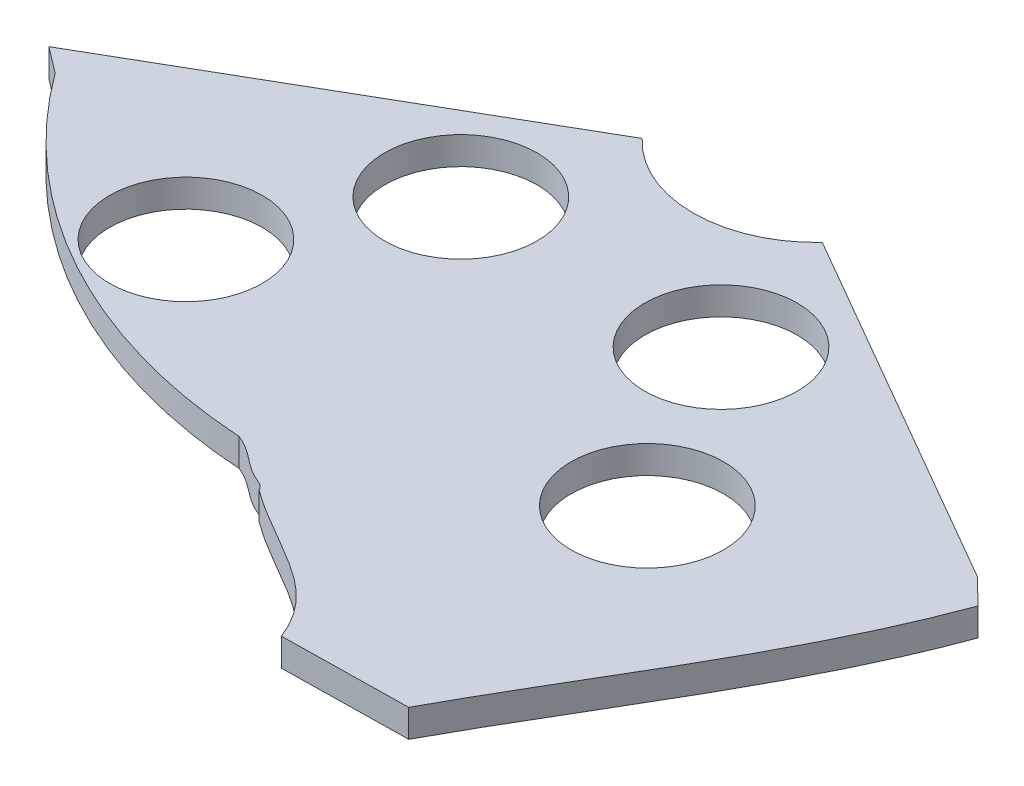
ISO-10303-21;
HEADER;
FILE_DESCRIPTION(('STEP AP214'),'2;1');
FILE_NAME('part.step','',(''),(''),'','','');
FILE_SCHEMA(('AUTOMOTIVE_DESIGN { 1 0 10303 214 1 1 1 1 }'));
ENDSEC;
DATA;
#1=APPLICATION_CONTEXT('core data for automotive mechanical design processes');
#2=APPLICATION_PROTOCOL_DEFINITION('international standard','automotive_design',2000,#1);
#3=PRODUCT_CONTEXT('',#1,'mechanical');
#4=PRODUCT('Part','Part','',(#3));
#5=PRODUCT_RELATED_PRODUCT_CATEGORY('part','',(#4));
#6=PRODUCT_DEFINITION_FORMATION('','',#4);
#7=PRODUCT_DEFINITION_CONTEXT('part definition',#1,'design');
#8=PRODUCT_DEFINITION('design','',#6,#7);
#9=PRODUCT_DEFINITION_SHAPE('','',#8);
#10=(LENGTH_UNIT() NAMED_UNIT(*) SI_UNIT(.MILLI.,.METRE.));
#11=(NAMED_UNIT(*) PLANE_ANGLE_UNIT() SI_UNIT($,.RADIAN.));
#12=(NAMED_UNIT(*) SI_UNIT($,.STERADIAN.) SOLID_ANGLE_UNIT());
#13=UNCERTAINTY_MEASURE_WITH_UNIT(LENGTH_MEASURE(1.E-05),#10,'distance_accuracy_value','');
#14=(GEOMETRIC_REPRESENTATION_CONTEXT(3) GLOBAL_UNCERTAINTY_ASSIGNED_CONTEXT((#13)) GLOBAL_UNIT_ASSIGNED_CONTEXT((#10,
#11,#12)) REPRESENTATION_CONTEXT('',''));
#15=CARTESIAN_POINT('',(0.,0.,0.));
#16=DIRECTION('',(0.,0.,1.));
#17=DIRECTION('',(1.,0.,0.));
#18=AXIS2_PLACEMENT_3D('',#15,#16,#17);
#19=CARTESIAN_POINT('',(0.,-59.7359999999999,0.));
#20=DIRECTION('',(0.,-1.,0.));
#21=DIRECTION('',(0.,0.,-1.));
#22=AXIS2_PLACEMENT_3D('',#19,#20,#21);
#23=PLANE('',#22);
#24=CARTESIAN_POINT('',(18.75,-59.7359999999999,32.476));
#25=DIRECTION('',(0.,-1.,0.));
#26=DIRECTION('',(0.,0.,-1.));
#27=AXIS2_PLACEMENT_3D('',#24,#25,#26);
#28=CIRCLE('',#27,10.999845998306);
#29=CARTESIAN_POINT('',(18.75,-59.7359999999999,21.476154001694));
#30=VERTEX_POINT('',#29);
#31=EDGE_CURVE('E330',#30,#30,#28,.T.);
#32=ORIENTED_EDGE('',*,*,#31,.F.);
#33=EDGE_LOOP('',(#32));
#34=FACE_BOUND('',#33,.T.);
#35=CARTESIAN_POINT('',(-33.25,-59.7359999999999,57.591));
#36=DIRECTION('',(0.,-1.,0.));
#37=DIRECTION('',(0.,0.,-1.));
#38=AXIS2_PLACEMENT_3D('',#35,#36,#37);
#39=CIRCLE('',#38,10.999845998306);
#40=CARTESIAN_POINT('',(-33.25,-59.7359999999999,46.591154001694));
#41=VERTEX_POINT('',#40);
#42=EDGE_CURVE('E323',#41,#41,#39,.T.);
#43=ORIENTED_EDGE('',*,*,#42,.F.);
#44=EDGE_LOOP('',(#43));
#45=FACE_BOUND('',#44,.T.);
#46=DIRECTION('',(-0.795778748412786,0.,-0.605587469796543));
#47=VECTOR('',#46,1.);
#48=CARTESIAN_POINT('',(-63.3976054615555,-59.7359999999999,46.2919343296422));
#49=LINE('',#48,#47);
#50=CARTESIAN_POINT('',(-63.3976054615555,-59.7359999999999,46.2919343296422));
#51=VERTEX_POINT('',#50);
#52=CARTESIAN_POINT('',(-67.1861912285639,-59.7359999999999,43.4088213119524));
#53=VERTEX_POINT('',#52);
#54=EDGE_CURVE('E319',#51,#53,#49,.T.);
#55=ORIENTED_EDGE('',*,*,#54,.T.);
#56=DIRECTION('',(0.866025113443952,0.,-0.500000502884138));
#57=VECTOR('',#56,1.);
#58=CARTESIAN_POINT('',(-67.1861912285639,-59.7359999999999,43.4088213119524));
#59=LINE('',#58,#57);
#60=CARTESIAN_POINT('',(-12.9766531358799,-59.7359999999999,12.1108879302399));
#61=VERTEX_POINT('',#60);
#62=EDGE_CURVE('E101',#53,#61,#59,.T.);
#63=ORIENTED_EDGE('',*,*,#62,.T.);
#64=CARTESIAN_POINT('',(0.,-59.7359999999999,0.));
#65=DIRECTION('',(0.,1.,0.));
#66=DIRECTION('',(0.,0.,-1.));
#67=AXIS2_PLACEMENT_3D('',#64,#65,#66);
#68=CIRCLE('',#67,17.7501305084715);
#69=CARTESIAN_POINT('',(12.9766531358511,-59.7359999999999,12.1108879302707));
#70=VERTEX_POINT('',#69);
#71=EDGE_CURVE('E316',#61,#70,#68,.T.);
#72=ORIENTED_EDGE('',*,*,#71,.T.);
#73=DIRECTION('',(0.866025113442762,0.,0.500000502886198));
#74=VECTOR('',#73,1.);
#75=CARTESIAN_POINT('',(12.9766531358511,-59.7359999999999,12.1108879302707));
#76=LINE('',#75,#74);
#77=CARTESIAN_POINT('',(65.8946490574716,-59.7359999999999,42.6631480920527));
#78=VERTEX_POINT('',#77);
#79=EDGE_CURVE('E311',#70,#78,#76,.T.);
#80=ORIENTED_EDGE('',*,*,#79,.T.);
#81=DIRECTION('',(0.714858802905581,0.,0.699268826638511));
#82=VECTOR('',#81,1.);
#83=CARTESIAN_POINT('',(65.8946490574716,-59.7359999999999,42.6631480920527));
#84=LINE('',#83,#82);
#85=CARTESIAN_POINT('',(69.5740968074287,-59.7359999999999,46.262352718662));
#86=VERTEX_POINT('',#85);
#87=EDGE_CURVE('E292',#78,#86,#84,.T.);
#88=ORIENTED_EDGE('',*,*,#87,.T.);
#89=CARTESIAN_POINT('',(41.2022316805523,-59.7359999999999,99.9375894083744));
#90=CARTESIAN_POINT('',(41.587590850784,-59.7359999999999,99.2311174933776));
#91=CARTESIAN_POINT('',(42.4034808120674,-59.7359999999999,97.7353613575421));
#92=CARTESIAN_POINT('',(43.7326495851466,-59.7359999999999,95.3570769045197));
#93=CARTESIAN_POINT('',(45.1853632791796,-59.7359999999999,92.800608914617));
#94=CARTESIAN_POINT('',(47.2275819494652,-59.7359999999999,89.2653916030542));
#95=CARTESIAN_POINT('',(49.814915188434,-59.7359999999999,84.8664305212319));
#96=CARTESIAN_POINT('',(52.930931883902,-59.7359999999999,79.5943849454348));
#97=CARTESIAN_POINT('',(56.0131271613358,-59.7359999999999,74.3030822466267));
#98=CARTESIAN_POINT('',(59.0165757328589,-59.7359999999999,68.9704357376071));
#99=CARTESIAN_POINT('',(61.8976180321011,-59.7359999999999,63.577037593729));
#100=CARTESIAN_POINT('',(64.3234409959134,-59.7359999999999,58.692273061032));
#101=CARTESIAN_POINT('',(66.314934083995,-59.7359999999999,54.3541361936122));
#102=CARTESIAN_POINT('',(67.9112616717491,-59.7359999999999,50.6071095903698));
#103=CARTESIAN_POINT('',(68.9692965092425,-59.7359999999999,47.905511475029));
#104=CARTESIAN_POINT('',(69.5022446270759,-59.7359999999999,46.4575651543451));
#105=CARTESIAN_POINT('',(69.5740968074287,-59.7359999999999,46.262352718662));
#106=B_SPLINE_CURVE_WITH_KNOTS('',3,(#89,#90,#91,#92,#93,#94,#95,#96,#97,#98,#99,#100,#101,#102,
#103,#104,#105),.UNSPECIFIED.,.F.,.F.,(4,1,1,1,1,1,1,1,1,1,1,1,1,1,4),(0.,0.0397133337730413,
0.084081845866122,0.134451050187205,0.184819560422879,0.285559850952788,0.386302098336289,
0.487039816466733,0.587749506713704,0.688318548702813,0.78876366613469,0.856846763089356,
0.923857801930417,0.989734492411012,1.),.UNSPECIFIED.);
#107=CARTESIAN_POINT('',(41.2022316805523,-59.7359999999999,99.9375894083744));
#108=VERTEX_POINT('',#107);
#109=EDGE_CURVE('E244',#86,#108,#106,.F.);
#110=ORIENTED_EDGE('',*,*,#109,.T.);
#111=DIRECTION('',(-0.999865416606513,0.,0.0164057512563092));
#112=VECTOR('',#111,1.);
#113=CARTESIAN_POINT('',(41.2022316805523,-59.7359999999999,99.9375894083744));
#114=LINE('',#113,#112);
#115=CARTESIAN_POINT('',(23.1548354485309,-59.7359999999999,100.233710354743));
#116=VERTEX_POINT('',#115);
#117=EDGE_CURVE('E128',#108,#116,#114,.T.);
#118=ORIENTED_EDGE('',*,*,#117,.T.);
#119=CARTESIAN_POINT('',(3.30286328056951,-59.7359999999999,83.5958777362196));
#120=CARTESIAN_POINT('',(3.3608909746237,-59.7359999999999,83.6389832121567));
#121=CARTESIAN_POINT('',(3.70442717781917,-59.7359999999999,83.8926363081411));
#122=CARTESIAN_POINT('',(4.38582003086082,-59.7359999999999,84.3796681121888));
#123=CARTESIAN_POINT('',(5.33763976577211,-59.7359999999999,85.0223883529612));
#124=CARTESIAN_POINT('',(6.32831377654757,-59.7359999999999,85.6585236441902));
#125=CARTESIAN_POINT('',(7.63510659117863,-59.7359999999999,86.4643297552144));
#126=CARTESIAN_POINT('',(9.2912723206019,-59.7359999999999,87.4377400955666));
#127=CARTESIAN_POINT('',(11.2916173590414,-59.7359999999999,88.584841295683));
#128=CARTESIAN_POINT('',(13.2826935567036,-59.7359999999999,89.7481182065134));
#129=CARTESIAN_POINT('',(15.2427814807173,-59.7359999999999,90.9655428347965));
#130=CARTESIAN_POINT('',(17.1337855048151,-59.7359999999999,92.2885452830852));
#131=CARTESIAN_POINT('',(18.6090414025556,-59.7359999999999,93.5279288708465));
#132=CARTESIAN_POINT('',(19.6875252153407,-59.7359999999999,94.614708458911));
#133=CARTESIAN_POINT('',(20.4404680205473,-59.7359999999999,95.4791931501594));
#134=CARTESIAN_POINT('',(21.1319454879863,-59.7359999999999,96.3930602987408));
#135=CARTESIAN_POINT('',(21.6329382160324,-59.7359999999999,97.1609273376954));
#136=CARTESIAN_POINT('',(21.9780920152773,-59.7359999999999,97.7490006718454));
#137=CARTESIAN_POINT('',(22.1947605858977,-59.7359999999999,98.1409934068086));
#138=CARTESIAN_POINT('',(22.4032360485551,-59.7359999999999,98.5418147536676));
#139=CARTESIAN_POINT('',(22.6036728898914,-59.7359999999999,98.9515298694288));
#140=CARTESIAN_POINT('',(22.795929091683,-59.7359999999999,99.3702957052518));
#141=CARTESIAN_POINT('',(22.9809507296413,-59.7359999999999,99.7978314683164));
#142=CARTESIAN_POINT('',(23.0966528751182,-59.7359999999999,100.087863408154));
#143=CARTESIAN_POINT('',(23.1548354485267,-59.7359999999999,100.233710354732));
#144=B_SPLINE_CURVE_WITH_KNOTS('',3,(#119,#120,#121,#122,#123,#124,#125,#126,#127,#128,#129,
#130,#131,#132,#133,#134,#135,#136,#137,#138,#139,#140,#141,#142,#143),.UNSPECIFIED.,.F.,.F.,(4,
1,1,1,1,1,1,1,1,1,1,1,1,1,1,1,1,1,1,1,1,1,4),(3.97459842815806E-13,0.00767665972014964,
0.045349840796591,0.0889469985817752,0.129639070193832,0.170382328198246,0.251994615879282,
0.333651337507287,0.415288377679459,0.496898919047709,0.57864917083408,0.660218146277274,
0.701107392742712,0.741158581153687,0.781882858535246,0.822722833742814,0.838448214590161,
0.854297569189187,0.870285875653164,0.886427244551638,0.902734899223733,0.919221163728598,
0.935897457732388),.UNSPECIFIED.);
#145=CARTESIAN_POINT('',(3.30286328056951,-59.7359999999999,83.5958777362196));
#146=VERTEX_POINT('',#145);
#147=EDGE_CURVE('E120',#116,#146,#144,.F.);
#148=ORIENTED_EDGE('',*,*,#147,.T.);
#149=CARTESIAN_POINT('',(-4.80739946604368,-59.7359999999999,78.3520188363465));
#150=CARTESIAN_POINT('',(-4.73455750919589,-59.7359999999999,78.3812123659429));
#151=CARTESIAN_POINT('',(-4.59647391436689,-59.7359999999999,78.4365533766302));
#152=CARTESIAN_POINT('',(-4.3066154627874,-59.7359999999999,78.561126644264));
#153=CARTESIAN_POINT('',(-3.79140364004989,-59.7359999999999,78.8027291367296));
#154=CARTESIAN_POINT('',(-3.065391075989,-59.7359999999999,79.2091978337572));
#155=CARTESIAN_POINT('',(-2.23987012826526,-59.7359999999999,79.7708204394431));
#156=CARTESIAN_POINT('',(-1.57901410093857,-59.7359999999999,80.2776897801323));
#157=CARTESIAN_POINT('',(-1.05231170950876,-59.7359999999999,80.6876743089049));
#158=CARTESIAN_POINT('',(-0.522756427642757,-59.7359999999999,81.0928916417694));
#159=CARTESIAN_POINT('',(0.154236222637435,-59.7359999999999,81.5779314075019));
#160=CARTESIAN_POINT('',(0.869839658943289,-59.7359999999999,82.0059207982046));
#161=CARTESIAN_POINT('',(1.38063736938718,-59.7359999999999,82.2600452104259));
#162=CARTESIAN_POINT('',(2.20063168074346,-59.7359999999999,82.6307927810848));
#163=CARTESIAN_POINT('',(2.90888002950248,-59.7359999999999,82.839217800842));
#164=CARTESIAN_POINT('',(3.30286328056951,-59.7359999999999,83.5958777362196));
#165=B_SPLINE_CURVE_WITH_KNOTS('',3,(#149,#150,#151,#152,#153,#154,#155,#156,#157,#158,#159,
#160,#161,#162,#163,#164),.UNSPECIFIED.,.F.,.F.,(4,1,1,1,1,1,1,1,1,1,1,1,1,4),
(-0.384221548559676,-0.354367447155518,-0.327628318220057,-0.264203388830081,-0.137946895486287,
-0.0115855922126117,0.115315082359378,0.178857348466051,0.242349904739312,0.369001069391675,
0.495501743094686,0.559041797539317,0.585959556689903,0.837832479723285),.UNSPECIFIED.);
#166=CARTESIAN_POINT('',(-4.80739946604369,-59.7359999999999,78.3520188363465));
#167=VERTEX_POINT('',#166);
#168=EDGE_CURVE('E125',#146,#167,#165,.F.);
#169=ORIENTED_EDGE('',*,*,#168,.T.);
#170=CARTESIAN_POINT('',(-63.3976054615555,-59.7359999999999,46.2919343296422));
#171=CARTESIAN_POINT('',(-61.7027545982898,-59.7359999999999,48.61405866068));
#172=CARTESIAN_POINT('',(-59.88107195284,-59.7359999999999,50.8409339533637));
#173=CARTESIAN_POINT('',(-56.001446687664,-59.7359999999999,55.0843881225585));
#174=CARTESIAN_POINT('',(-53.9451285067241,-59.7359999999999,57.0999477017867));
#175=CARTESIAN_POINT('',(-47.46495092182,-59.7359999999999,62.7891006094329));
#176=CARTESIAN_POINT('',(-42.7252883495876,-59.7359999999999,66.1049510104305));
#177=CARTESIAN_POINT('',(-32.6399911130492,-59.7359999999999,71.6239606867097));
#178=CARTESIAN_POINT('',(-27.2922142818301,-59.7359999999999,73.8277759318656));
#179=CARTESIAN_POINT('',(-16.2451122340973,-59.7359999999999,77.0150372937901));
#180=CARTESIAN_POINT('',(-10.5460609124712,-59.7359999999999,78.0002270341735));
#181=CARTESIAN_POINT('',(-4.80739946632093,-59.7359999999999,78.3520188408731));
#182=B_SPLINE_CURVE_WITH_KNOTS('',3,(#170,#171,#172,#173,#174,#175,#176,#177,#178,#179,#180,
#181),.UNSPECIFIED.,.F.,.F.,(4,2,2,2,2,4),(1.46671355860661E-06,0.125001466713558,
0.250001466713558,0.500001466713558,0.750001466713558,1.),.UNSPECIFIED.);
#183=EDGE_CURVE('E49',#167,#51,#182,.F.);
#184=ORIENTED_EDGE('',*,*,#183,.T.);
#185=EDGE_LOOP('',(#55,#63,#72,#80,#88,#110,#118,#148,#169,#184));
#186=FACE_BOUND('',#185,.T.);
#187=CARTESIAN_POINT('',(33.25,-59.7359999999999,57.591));
#188=DIRECTION('',(0.,-1.,0.));
#189=DIRECTION('',(0.,0.,-1.));
#190=AXIS2_PLACEMENT_3D('',#187,#188,#189);
#191=CIRCLE('',#190,10.999845998306);
#192=CARTESIAN_POINT('',(33.25,-59.7359999999999,46.591154001694));
#193=VERTEX_POINT('',#192);
#194=EDGE_CURVE('E324',#193,#193,#191,.T.);
#195=ORIENTED_EDGE('',*,*,#194,.F.);
#196=EDGE_LOOP('',(#195));
#197=FACE_BOUND('',#196,.T.);
#198=CARTESIAN_POINT('',(-18.75,-59.7359999999999,32.476));
#199=DIRECTION('',(0.,-1.,0.));
#200=DIRECTION('',(0.,0.,-1.));
#201=AXIS2_PLACEMENT_3D('',#198,#199,#200);
#202=CIRCLE('',#201,10.999845998306);
#203=CARTESIAN_POINT('',(-18.75,-59.7359999999999,21.476154001694));
#204=VERTEX_POINT('',#203);
#205=EDGE_CURVE('E336',#204,#204,#202,.T.);
#206=ORIENTED_EDGE('',*,*,#205,.F.);
#207=EDGE_LOOP('',(#206));
#208=FACE_BOUND('',#207,.T.);
#209=ADVANCED_FACE('F30',(#34,#45,#186,#197,#208),#23,.T.);
#210=CARTESIAN_POINT('',(0.,-55.7359999999999,0.));
#211=DIRECTION('',(0.,-1.,0.));
#212=DIRECTION('',(0.,0.,-1.));
#213=AXIS2_PLACEMENT_3D('',#210,#211,#212);
#214=PLANE('',#213);
#215=CARTESIAN_POINT('',(18.75,-55.7359999999999,32.476));
#216=DIRECTION('',(0.,-1.,0.));
#217=DIRECTION('',(0.,0.,-1.));
#218=AXIS2_PLACEMENT_3D('',#215,#216,#217);
#219=CIRCLE('',#218,10.999845998306);
#220=CARTESIAN_POINT('',(18.75,-55.7359999999999,21.476154001694));
#221=VERTEX_POINT('',#220);
#222=EDGE_CURVE('E333',#221,#221,#219,.T.);
#223=ORIENTED_EDGE('',*,*,#222,.T.);
#224=EDGE_LOOP('',(#223));
#225=FACE_BOUND('',#224,.T.);
#226=CARTESIAN_POINT('',(-33.25,-55.7359999999999,57.591));
#227=DIRECTION('',(0.,-1.,0.));
#228=DIRECTION('',(0.,0.,-1.));
#229=AXIS2_PLACEMENT_3D('',#226,#227,#228);
#230=CIRCLE('',#229,10.999845998306);
#231=CARTESIAN_POINT('',(-33.25,-55.7359999999999,46.591154001694));
#232=VERTEX_POINT('',#231);
#233=EDGE_CURVE('E320',#232,#232,#230,.T.);
#234=ORIENTED_EDGE('',*,*,#233,.T.);
#235=EDGE_LOOP('',(#234));
#236=FACE_BOUND('',#235,.T.);
#237=DIRECTION('',(-0.795778748412786,0.,-0.605587469796543));
#238=VECTOR('',#237,1.);
#239=CARTESIAN_POINT('',(-63.3976054615555,-55.7359999999999,46.2919343296422));
#240=LINE('',#239,#238);
#241=CARTESIAN_POINT('',(-63.3976054615555,-55.7359999999999,46.2919343296422));
#242=VERTEX_POINT('',#241);
#243=CARTESIAN_POINT('',(-67.1861912285639,-55.7359999999999,43.4088213119524));
#244=VERTEX_POINT('',#243);
#245=EDGE_CURVE('E192',#242,#244,#240,.T.);
#246=ORIENTED_EDGE('',*,*,#245,.F.);
#247=CARTESIAN_POINT('',(-4.80729846205365,-55.7359999999999,78.3520250325778));
#248=CARTESIAN_POINT('',(-10.5459940410661,-55.7359999999999,78.0002385941496));
#249=CARTESIAN_POINT('',(-16.2450798281336,-55.7359999999999,77.0150466434164));
#250=CARTESIAN_POINT('',(-27.2922142818301,-55.7359999999999,73.8277759318656));
#251=CARTESIAN_POINT('',(-32.6399911130492,-55.7359999999999,71.6239606867097));
#252=CARTESIAN_POINT('',(-42.7252883495876,-55.7359999999999,66.1049510104305));
#253=CARTESIAN_POINT('',(-47.46495092182,-55.7359999999999,62.7891006094329));
#254=CARTESIAN_POINT('',(-53.9451285067241,-55.7359999999999,57.0999477017867));
#255=CARTESIAN_POINT('',(-56.001446687664,-55.7359999999999,55.0843881225585));
#256=CARTESIAN_POINT('',(-59.88107195284,-55.7359999999999,50.8409339533637));
#257=CARTESIAN_POINT('',(-61.7027545982898,-55.7359999999999,48.61405866068));
#258=CARTESIAN_POINT('',(-63.3976054615555,-55.7359999999999,46.2919343296422));
#259=B_SPLINE_CURVE_WITH_KNOTS('',3,(#247,#248,#249,#250,#251,#252,#253,#254,#255,#256,#257,
#258),.UNSPECIFIED.,.F.,.F.,(4,2,2,2,2,4),(0.,0.25,0.5,0.75,0.875,1.),.UNSPECIFIED.);
#260=CARTESIAN_POINT('',(-4.80739946604369,-55.7359999999999,78.3520188363465));
#261=VERTEX_POINT('',#260);
#262=EDGE_CURVE('E92',#261,#242,#259,.T.);
#263=ORIENTED_EDGE('',*,*,#262,.F.);
#264=CARTESIAN_POINT('',(3.30286328056951,-55.7359999999999,83.5958777362196));
#265=CARTESIAN_POINT('',(2.90888002950248,-55.7359999999999,82.839217800842));
#266=CARTESIAN_POINT('',(2.20063168074346,-55.7359999999999,82.6307927810848));
#267=CARTESIAN_POINT('',(1.38063736938718,-55.7359999999999,82.2600452104259));
#268=CARTESIAN_POINT('',(0.869839658943289,-55.7359999999999,82.0059207982046));
#269=CARTESIAN_POINT('',(0.154236222637435,-55.7359999999999,81.5779314075019));
#270=CARTESIAN_POINT('',(-0.522756427642757,-55.7359999999999,81.0928916417694));
#271=CARTESIAN_POINT('',(-1.05231170950876,-55.7359999999999,80.6876743089049));
#272=CARTESIAN_POINT('',(-1.57901410093857,-55.7359999999999,80.2776897801323));
#273=CARTESIAN_POINT('',(-2.23987012826526,-55.7359999999999,79.7708204394431));
#274=CARTESIAN_POINT('',(-3.065391075989,-55.7359999999999,79.2091978337572));
#275=CARTESIAN_POINT('',(-3.79140364004989,-55.7359999999999,78.8027291367296));
#276=CARTESIAN_POINT('',(-4.3066154627874,-55.7359999999999,78.561126644264));
#277=CARTESIAN_POINT('',(-4.59647391436689,-55.7359999999999,78.4365533766302));
#278=CARTESIAN_POINT('',(-4.73455750919589,-55.7359999999999,78.3812123659429));
#279=CARTESIAN_POINT('',(-4.80739946604368,-55.7359999999999,78.3520188363465));
#280=B_SPLINE_CURVE_WITH_KNOTS('',3,(#264,#265,#266,#267,#268,#269,#270,#271,#272,#273,#274,
#275,#276,#277,#278,#279),.UNSPECIFIED.,.F.,.F.,(4,1,1,1,1,1,1,1,1,1,1,1,1,4),
(-0.384221548559676,-0.132348625526295,-0.105430866375709,-0.0418908119310771,0.084609861771933,
0.211261026424296,0.274753582697558,0.338295848804231,0.46519652337622,0.591557826649895,
0.717814319993689,0.781239249383665,0.807978378319127,0.837832479723285),.UNSPECIFIED.);
#281=CARTESIAN_POINT('',(3.30286328056951,-55.7359999999999,83.5958777362196));
#282=VERTEX_POINT('',#281);
#283=EDGE_CURVE('E85',#282,#261,#280,.T.);
#284=ORIENTED_EDGE('',*,*,#283,.F.);
#285=CARTESIAN_POINT('',(23.1548354485267,-55.7359999999999,100.233710354732));
#286=CARTESIAN_POINT('',(23.0966528751182,-55.7359999999999,100.087863408154));
#287=CARTESIAN_POINT('',(22.9809507296413,-55.7359999999999,99.7978314683164));
#288=CARTESIAN_POINT('',(22.795929091683,-55.7359999999999,99.3702957052518));
#289=CARTESIAN_POINT('',(22.6036728898914,-55.7359999999999,98.9515298694288));
#290=CARTESIAN_POINT('',(22.4032360485551,-55.7359999999999,98.5418147536676));
#291=CARTESIAN_POINT('',(22.1947605858977,-55.7359999999999,98.1409934068086));
#292=CARTESIAN_POINT('',(21.9780920152773,-55.7359999999999,97.7490006718454));
#293=CARTESIAN_POINT('',(21.6329382160324,-55.7359999999999,97.1609273376954));
#294=CARTESIAN_POINT('',(21.1319454879863,-55.7359999999999,96.3930602987408));
#295=CARTESIAN_POINT('',(20.4404680205473,-55.7359999999999,95.4791931501594));
#296=CARTESIAN_POINT('',(19.6875252153407,-55.7359999999999,94.614708458911));
#297=CARTESIAN_POINT('',(18.6090414025556,-55.7359999999999,93.5279288708465));
#298=CARTESIAN_POINT('',(17.1337855048151,-55.7359999999999,92.2885452830852));
#299=CARTESIAN_POINT('',(15.2427814807173,-55.7359999999999,90.9655428347965));
#300=CARTESIAN_POINT('',(13.2826935567036,-55.7359999999999,89.7481182065134));
#301=CARTESIAN_POINT('',(11.2916173590414,-55.7359999999999,88.584841295683));
#302=CARTESIAN_POINT('',(9.2912723206019,-55.7359999999999,87.4377400955666));
#303=CARTESIAN_POINT('',(7.63510659117863,-55.7359999999999,86.4643297552144));
#304=CARTESIAN_POINT('',(6.32831377654757,-55.7359999999999,85.6585236441902));
#305=CARTESIAN_POINT('',(5.33763976577211,-55.7359999999999,85.0223883529612));
#306=CARTESIAN_POINT('',(4.38582003086082,-55.7359999999999,84.3796681121888));
#307=CARTESIAN_POINT('',(3.70442717781917,-55.7359999999999,83.8926363081411));
#308=CARTESIAN_POINT('',(3.3608909746237,-55.7359999999999,83.6389832121567));
#309=CARTESIAN_POINT('',(3.30286328056951,-55.7359999999999,83.5958777362196));
#310=B_SPLINE_CURVE_WITH_KNOTS('',3,(#285,#286,#287,#288,#289,#290,#291,#292,#293,#294,#295,
#296,#297,#298,#299,#300,#301,#302,#303,#304,#305,#306,#307,#308,#309),.UNSPECIFIED.,.F.,.F.,(4,
1,1,1,1,1,1,1,1,1,1,1,1,1,1,1,1,1,1,1,1,1,4),(3.97455229715557E-13,0.0166762940041877,
0.0331625585090531,0.0494702131811479,0.0656115820796215,0.0815998885435992,0.0974492431426248,
0.113174623989972,0.15401459919754,0.194738876579099,0.234790064990074,0.275679311455511,
0.357248286898705,0.438998538685077,0.520609080053327,0.602246120225499,0.683902841853504,
0.76551512953454,0.806258387538954,0.846950459151011,0.890547616936195,0.928220798012636,
0.935897457732388),.UNSPECIFIED.);
#311=CARTESIAN_POINT('',(23.1548354485309,-55.7359999999999,100.233710354743));
#312=VERTEX_POINT('',#311);
#313=EDGE_CURVE('E138',#312,#282,#310,.T.);
#314=ORIENTED_EDGE('',*,*,#313,.F.);
#315=DIRECTION('',(-0.999865416606513,0.,0.0164057512563092));
#316=VECTOR('',#315,1.);
#317=CARTESIAN_POINT('',(41.2022316805523,-55.7359999999999,99.9375894083744));
#318=LINE('',#317,#316);
#319=CARTESIAN_POINT('',(41.2022316805523,-55.7359999999999,99.9375894083744));
#320=VERTEX_POINT('',#319);
#321=EDGE_CURVE('E265',#320,#312,#318,.T.);
#322=ORIENTED_EDGE('',*,*,#321,.F.);
#323=CARTESIAN_POINT('',(69.5740968074287,-55.7359999999999,46.262352718662));
#324=CARTESIAN_POINT('',(69.5022446270759,-55.7359999999999,46.4575651543451));
#325=CARTESIAN_POINT('',(68.9692965092425,-55.7359999999999,47.905511475029));
#326=CARTESIAN_POINT('',(67.9112616717491,-55.7359999999999,50.6071095903698));
#327=CARTESIAN_POINT('',(66.314934083995,-55.7359999999999,54.3541361936122));
#328=CARTESIAN_POINT('',(64.3234409959134,-55.7359999999999,58.692273061032));
#329=CARTESIAN_POINT('',(61.8976180321011,-55.7359999999999,63.577037593729));
#330=CARTESIAN_POINT('',(59.0165757328589,-55.7359999999999,68.9704357376071));
#331=CARTESIAN_POINT('',(56.0131271613358,-55.7359999999999,74.3030822466267));
#332=CARTESIAN_POINT('',(52.930931883902,-55.7359999999999,79.5943849454348));
#333=CARTESIAN_POINT('',(49.814915188434,-55.7359999999999,84.8664305212319));
#334=CARTESIAN_POINT('',(47.2275819494652,-55.7359999999999,89.2653916030542));
#335=CARTESIAN_POINT('',(45.1853632791796,-55.7359999999999,92.800608914617));
#336=CARTESIAN_POINT('',(43.7326495851466,-55.7359999999999,95.3570769045197));
#337=CARTESIAN_POINT('',(42.4034808120674,-55.7359999999999,97.7353613575421));
#338=CARTESIAN_POINT('',(41.587590850784,-55.7359999999999,99.2311174933776));
#339=CARTESIAN_POINT('',(41.2022316805523,-55.7359999999999,99.9375894083744));
#340=B_SPLINE_CURVE_WITH_KNOTS('',3,(#323,#324,#325,#326,#327,#328,#329,#330,#331,#332,#333,
#334,#335,#336,#337,#338,#339),.UNSPECIFIED.,.F.,.F.,(4,1,1,1,1,1,1,1,1,1,1,1,1,1,4),(0.,
0.0102655075889884,0.0761421980695828,0.143153236910644,0.21123633386531,0.311681451297187,
0.412250493286296,0.512960183533267,0.613697901663711,0.714440149047212,0.815180439577121,
0.865548949812795,0.915918154133878,0.960286666226959,1.),.UNSPECIFIED.);
#341=CARTESIAN_POINT('',(69.5740968074287,-55.7359999999999,46.262352718662));
#342=VERTEX_POINT('',#341);
#343=EDGE_CURVE('E272',#342,#320,#340,.T.);
#344=ORIENTED_EDGE('',*,*,#343,.F.);
#345=DIRECTION('',(0.714858802905581,0.,0.699268826638511));
#346=VECTOR('',#345,1.);
#347=CARTESIAN_POINT('',(65.8946490574716,-55.7359999999999,42.6631480920527));
#348=LINE('',#347,#346);
#349=CARTESIAN_POINT('',(65.8946490574716,-55.7359999999999,42.6631480920527));
#350=VERTEX_POINT('',#349);
#351=EDGE_CURVE('E196',#350,#342,#348,.T.);
#352=ORIENTED_EDGE('',*,*,#351,.F.);
#353=DIRECTION('',(0.866025113442762,0.,0.500000502886198));
#354=VECTOR('',#353,1.);
#355=CARTESIAN_POINT('',(12.9766531358511,-55.7359999999999,12.1108879302707));
#356=LINE('',#355,#354);
#357=CARTESIAN_POINT('',(12.9766531358511,-55.7359999999999,12.1108879302707));
#358=VERTEX_POINT('',#357);
#359=EDGE_CURVE('E194',#358,#350,#356,.T.);
#360=ORIENTED_EDGE('',*,*,#359,.F.);
#361=CARTESIAN_POINT('',(0.,-55.7359999999999,0.));
#362=DIRECTION('',(0.,1.,0.));
#363=DIRECTION('',(0.,0.,-1.));
#364=AXIS2_PLACEMENT_3D('',#361,#362,#363);
#365=CIRCLE('',#364,17.7501305084715);
#366=CARTESIAN_POINT('',(-12.9766531358799,-55.7359999999999,12.1108879302399));
#367=VERTEX_POINT('',#366);
#368=EDGE_CURVE('E191',#367,#358,#365,.T.);
#369=ORIENTED_EDGE('',*,*,#368,.F.);
#370=DIRECTION('',(0.866025113443952,0.,-0.500000502884138));
#371=VECTOR('',#370,1.);
#372=CARTESIAN_POINT('',(-67.1861912285639,-55.7359999999999,43.4088213119524));
#373=LINE('',#372,#371);
#374=EDGE_CURVE('E186',#244,#367,#373,.T.);
#375=ORIENTED_EDGE('',*,*,#374,.F.);
#376=EDGE_LOOP('',(#246,#263,#284,#314,#322,#344,#352,#360,#369,#375));
#377=FACE_BOUND('',#376,.T.);
#378=CARTESIAN_POINT('',(33.25,-55.7359999999999,57.591));
#379=DIRECTION('',(0.,-1.,0.));
#380=DIRECTION('',(0.,0.,-1.));
#381=AXIS2_PLACEMENT_3D('',#378,#379,#380);
#382=CIRCLE('',#381,10.999845998306);
#383=CARTESIAN_POINT('',(33.25,-55.7359999999999,46.591154001694));
#384=VERTEX_POINT('',#383);
#385=EDGE_CURVE('E327',#384,#384,#382,.T.);
#386=ORIENTED_EDGE('',*,*,#385,.T.);
#387=EDGE_LOOP('',(#386));
#388=FACE_BOUND('',#387,.T.);
#389=CARTESIAN_POINT('',(-18.75,-55.7359999999999,32.476));
#390=DIRECTION('',(0.,-1.,0.));
#391=DIRECTION('',(0.,0.,-1.));
#392=AXIS2_PLACEMENT_3D('',#389,#390,#391);
#393=CIRCLE('',#392,10.999845998306);
#394=CARTESIAN_POINT('',(-18.75,-55.7359999999999,21.476154001694));
#395=VERTEX_POINT('',#394);
#396=EDGE_CURVE('E339',#395,#395,#393,.T.);
#397=ORIENTED_EDGE('',*,*,#396,.T.);
#398=EDGE_LOOP('',(#397));
#399=FACE_BOUND('',#398,.T.);
#400=ADVANCED_FACE('F218',(#225,#236,#377,#388,#399),#214,.F.);
#401=CARTESIAN_POINT('',(-63.3976054615555,-59.7359999999999,46.2919343296422));
#402=DIRECTION('',(0.605587469796543,0.,-0.795778748412786));
#403=DIRECTION('',(-0.795778748412786,0.,-0.605587469796543));
#404=AXIS2_PLACEMENT_3D('',#401,#402,#403);
#405=PLANE('',#404);
#406=ORIENTED_EDGE('',*,*,#245,.T.);
#407=DIRECTION('',(0.,1.,0.));
#408=VECTOR('',#407,1.);
#409=CARTESIAN_POINT('',(-67.1861912285639,-59.7359999999999,43.4088213119524));
#410=LINE('',#409,#408);
#411=EDGE_CURVE('E11',#53,#244,#410,.T.);
#412=ORIENTED_EDGE('',*,*,#411,.F.);
#413=ORIENTED_EDGE('',*,*,#54,.F.);
#414=DIRECTION('',(0.,1.,0.));
#415=VECTOR('',#414,1.);
#416=CARTESIAN_POINT('',(-63.3976054615555,-59.7359999999999,46.2919343296422));
#417=LINE('',#416,#415);
#418=EDGE_CURVE('E501',#51,#242,#417,.T.);
#419=ORIENTED_EDGE('',*,*,#418,.T.);
#420=EDGE_LOOP('',(#406,#412,#413,#419));
#421=FACE_BOUND('',#420,.T.);
#422=ADVANCED_FACE('F32',(#421),#405,.F.);
#423=CARTESIAN_POINT('',(-67.1861912285639,-59.7359999999999,43.4088213119524));
#424=DIRECTION('',(0.500000502884138,0.,0.866025113443952));
#425=DIRECTION('',(0.866025113443952,0.,-0.500000502884138));
#426=AXIS2_PLACEMENT_3D('',#423,#424,#425);
#427=PLANE('',#426);
#428=ORIENTED_EDGE('',*,*,#374,.T.);
#429=DIRECTION('',(0.,1.,0.));
#430=VECTOR('',#429,1.);
#431=CARTESIAN_POINT('',(-12.9766531358799,-59.7359999999999,12.1108879302399));
#432=LINE('',#431,#430);
#433=EDGE_CURVE('E40',#61,#367,#432,.T.);
#434=ORIENTED_EDGE('',*,*,#433,.F.);
#435=ORIENTED_EDGE('',*,*,#62,.F.);
#436=ORIENTED_EDGE('',*,*,#411,.T.);
#437=EDGE_LOOP('',(#428,#434,#435,#436));
#438=FACE_BOUND('',#437,.T.);
#439=ADVANCED_FACE('F358',(#438),#427,.F.);
#440=CARTESIAN_POINT('',(0.,-59.7359999999999,0.));
#441=DIRECTION('',(0.,1.,0.));
#442=DIRECTION('',(0.,0.,1.));
#443=AXIS2_PLACEMENT_3D('',#440,#441,#442);
#444=CYLINDRICAL_SURFACE('',#443,17.7501305084715);
#445=ORIENTED_EDGE('',*,*,#368,.T.);
#446=DIRECTION('',(0.,1.,0.));
#447=VECTOR('',#446,1.);
#448=CARTESIAN_POINT('',(12.9766531358511,-59.7359999999999,12.1108879302707));
#449=LINE('',#448,#447);
#450=EDGE_CURVE('E200',#70,#358,#449,.T.);
#451=ORIENTED_EDGE('',*,*,#450,.F.);
#452=ORIENTED_EDGE('',*,*,#71,.F.);
#453=ORIENTED_EDGE('',*,*,#433,.T.);
#454=EDGE_LOOP('',(#445,#451,#452,#453));
#455=FACE_BOUND('',#454,.T.);
#456=ADVANCED_FACE('F425',(#455),#444,.F.);
#457=CARTESIAN_POINT('',(12.9766531358511,-59.7359999999999,12.1108879302707));
#458=DIRECTION('',(-0.500000502886198,0.,0.866025113442762));
#459=DIRECTION('',(0.866025113442762,0.,0.500000502886198));
#460=AXIS2_PLACEMENT_3D('',#457,#458,#459);
#461=PLANE('',#460);
#462=ORIENTED_EDGE('',*,*,#359,.T.);
#463=DIRECTION('',(0.,1.,0.));
#464=VECTOR('',#463,1.);
#465=CARTESIAN_POINT('',(65.8946490574716,-59.7359999999999,42.6631480920527));
#466=LINE('',#465,#464);
#467=EDGE_CURVE('E197',#78,#350,#466,.T.);
#468=ORIENTED_EDGE('',*,*,#467,.F.);
#469=ORIENTED_EDGE('',*,*,#79,.F.);
#470=ORIENTED_EDGE('',*,*,#450,.T.);
#471=EDGE_LOOP('',(#462,#468,#469,#470));
#472=FACE_BOUND('',#471,.T.);
#473=ADVANCED_FACE('F417',(#472),#461,.F.);
#474=CARTESIAN_POINT('',(65.8946490574716,-59.7359999999999,42.6631480920527));
#475=DIRECTION('',(-0.699268826638511,0.,0.714858802905581));
#476=DIRECTION('',(0.714858802905581,0.,0.699268826638511));
#477=AXIS2_PLACEMENT_3D('',#474,#475,#476);
#478=PLANE('',#477);
#479=ORIENTED_EDGE('',*,*,#351,.T.);
#480=DIRECTION('',(0.,1.,0.));
#481=VECTOR('',#480,1.);
#482=CARTESIAN_POINT('',(69.5740968074287,-59.7359999999999,46.262352718662));
#483=LINE('',#482,#481);
#484=EDGE_CURVE('E201',#86,#342,#483,.T.);
#485=ORIENTED_EDGE('',*,*,#484,.F.);
#486=ORIENTED_EDGE('',*,*,#87,.F.);
#487=ORIENTED_EDGE('',*,*,#467,.T.);
#488=EDGE_LOOP('',(#479,#485,#486,#487));
#489=FACE_BOUND('',#488,.T.);
#490=ADVANCED_FACE('F304',(#489),#478,.F.);
#491=CARTESIAN_POINT('',(69.5740968074287,-59.7359999999999,46.262352718662));
#492=CARTESIAN_POINT('',(69.5022446270759,-59.7359999999999,46.4575651543451));
#493=CARTESIAN_POINT('',(68.9692965092425,-59.7359999999999,47.905511475029));
#494=CARTESIAN_POINT('',(67.9112616717491,-59.7359999999999,50.6071095903698));
#495=CARTESIAN_POINT('',(66.314934083995,-59.7359999999999,54.3541361936122));
#496=CARTESIAN_POINT('',(64.3234409959134,-59.7359999999999,58.692273061032));
#497=CARTESIAN_POINT('',(61.8976180321011,-59.7359999999999,63.577037593729));
#498=CARTESIAN_POINT('',(59.0165757328589,-59.7359999999999,68.9704357376071));
#499=CARTESIAN_POINT('',(56.0131271613358,-59.7359999999999,74.3030822466267));
#500=CARTESIAN_POINT('',(52.930931883902,-59.7359999999999,79.5943849454348));
#501=CARTESIAN_POINT('',(49.814915188434,-59.7359999999999,84.8664305212319));
#502=CARTESIAN_POINT('',(47.2275819494652,-59.7359999999999,89.2653916030542));
#503=CARTESIAN_POINT('',(45.1853632791796,-59.7359999999999,92.800608914617));
#504=CARTESIAN_POINT('',(43.7326495851466,-59.7359999999999,95.3570769045197));
#505=CARTESIAN_POINT('',(42.4034808120674,-59.7359999999999,97.7353613575421));
#506=CARTESIAN_POINT('',(41.587590850784,-59.7359999999999,99.2311174933776));
#507=CARTESIAN_POINT('',(41.2022316805523,-59.7359999999999,99.9375894083744));
#508=B_SPLINE_CURVE_WITH_KNOTS('',3,(#491,#492,#493,#494,#495,#496,#497,#498,#499,#500,#501,
#502,#503,#504,#505,#506,#507),.UNSPECIFIED.,.F.,.F.,(4,1,1,1,1,1,1,1,1,1,1,1,1,1,4),(0.,
0.0102655075889884,0.0761421980695828,0.143153236910644,0.21123633386531,0.311681451297187,
0.412250493286296,0.512960183533267,0.613697901663711,0.714440149047212,0.815180439577121,
0.865548949812795,0.915918154133878,0.960286666226959,1.),.UNSPECIFIED.);
#509=DIRECTION('',(0.,1.,0.));
#510=VECTOR('',#509,1.);
#511=SURFACE_OF_LINEAR_EXTRUSION('',#508,#510);
#512=ORIENTED_EDGE('',*,*,#343,.T.);
#513=DIRECTION('',(0.,1.,0.));
#514=VECTOR('',#513,1.);
#515=CARTESIAN_POINT('',(41.2022316805523,-59.7359999999999,99.9375894083744));
#516=LINE('',#515,#514);
#517=EDGE_CURVE('E248',#108,#320,#516,.T.);
#518=ORIENTED_EDGE('',*,*,#517,.F.);
#519=ORIENTED_EDGE('',*,*,#109,.F.);
#520=ORIENTED_EDGE('',*,*,#484,.T.);
#521=EDGE_LOOP('',(#512,#518,#519,#520));
#522=FACE_BOUND('',#521,.T.);
#523=ADVANCED_FACE('F294',(#522),#511,.F.);
#524=CARTESIAN_POINT('',(41.2022316805523,-59.7359999999999,99.9375894083744));
#525=DIRECTION('',(-0.0164057512563092,0.,-0.999865416606513));
#526=DIRECTION('',(-0.999865416606513,0.,0.0164057512563092));
#527=AXIS2_PLACEMENT_3D('',#524,#525,#526);
#528=PLANE('',#527);
#529=ORIENTED_EDGE('',*,*,#321,.T.);
#530=DIRECTION('',(0.,1.,0.));
#531=VECTOR('',#530,1.);
#532=CARTESIAN_POINT('',(23.1548354485309,-59.7359999999999,100.233710354743));
#533=LINE('',#532,#531);
#534=EDGE_CURVE('E140',#116,#312,#533,.T.);
#535=ORIENTED_EDGE('',*,*,#534,.F.);
#536=ORIENTED_EDGE('',*,*,#117,.F.);
#537=ORIENTED_EDGE('',*,*,#517,.T.);
#538=EDGE_LOOP('',(#529,#535,#536,#537));
#539=FACE_BOUND('',#538,.T.);
#540=ADVANCED_FACE('F303',(#539),#528,.F.);
#541=CARTESIAN_POINT('',(23.1548354485267,-59.7359999999999,100.233710354732));
#542=CARTESIAN_POINT('',(23.0966528751182,-59.7359999999999,100.087863408154));
#543=CARTESIAN_POINT('',(22.9809507296413,-59.7359999999999,99.7978314683164));
#544=CARTESIAN_POINT('',(22.795929091683,-59.7359999999999,99.3702957052518));
#545=CARTESIAN_POINT('',(22.6036728898914,-59.7359999999999,98.9515298694288));
#546=CARTESIAN_POINT('',(22.4032360485551,-59.7359999999999,98.5418147536676));
#547=CARTESIAN_POINT('',(22.1947605858977,-59.7359999999999,98.1409934068086));
#548=CARTESIAN_POINT('',(21.9780920152773,-59.7359999999999,97.7490006718454));
#549=CARTESIAN_POINT('',(21.6329382160324,-59.7359999999999,97.1609273376954));
#550=CARTESIAN_POINT('',(21.1319454879863,-59.7359999999999,96.3930602987408));
#551=CARTESIAN_POINT('',(20.4404680205473,-59.7359999999999,95.4791931501594));
#552=CARTESIAN_POINT('',(19.6875252153407,-59.7359999999999,94.614708458911));
#553=CARTESIAN_POINT('',(18.6090414025556,-59.7359999999999,93.5279288708465));
#554=CARTESIAN_POINT('',(17.1337855048151,-59.7359999999999,92.2885452830852));
#555=CARTESIAN_POINT('',(15.2427814807173,-59.7359999999999,90.9655428347965));
#556=CARTESIAN_POINT('',(13.2826935567036,-59.7359999999999,89.7481182065134));
#557=CARTESIAN_POINT('',(11.2916173590414,-59.7359999999999,88.584841295683));
#558=CARTESIAN_POINT('',(9.2912723206019,-59.7359999999999,87.4377400955666));
#559=CARTESIAN_POINT('',(7.63510659117863,-59.7359999999999,86.4643297552144));
#560=CARTESIAN_POINT('',(6.32831377654757,-59.7359999999999,85.6585236441902));
#561=CARTESIAN_POINT('',(5.33763976577211,-59.7359999999999,85.0223883529612));
#562=CARTESIAN_POINT('',(4.38582003086082,-59.7359999999999,84.3796681121888));
#563=CARTESIAN_POINT('',(3.70442717781917,-59.7359999999999,83.8926363081411));
#564=CARTESIAN_POINT('',(3.3608909746237,-59.7359999999999,83.6389832121567));
#565=CARTESIAN_POINT('',(3.30286328056951,-59.7359999999999,83.5958777362196));
#566=B_SPLINE_CURVE_WITH_KNOTS('',3,(#541,#542,#543,#544,#545,#546,#547,#548,#549,#550,#551,
#552,#553,#554,#555,#556,#557,#558,#559,#560,#561,#562,#563,#564,#565),.UNSPECIFIED.,.F.,.F.,(4,
1,1,1,1,1,1,1,1,1,1,1,1,1,1,1,1,1,1,1,1,1,4),(3.97455229715557E-13,0.0166762940041877,
0.0331625585090531,0.0494702131811479,0.0656115820796215,0.0815998885435992,0.0974492431426248,
0.113174623989972,0.15401459919754,0.194738876579099,0.234790064990074,0.275679311455511,
0.357248286898705,0.438998538685077,0.520609080053327,0.602246120225499,0.683902841853504,
0.76551512953454,0.806258387538954,0.846950459151011,0.890547616936195,0.928220798012636,
0.935897457732388),.UNSPECIFIED.);
#567=DIRECTION('',(0.,1.,0.));
#568=VECTOR('',#567,1.);
#569=SURFACE_OF_LINEAR_EXTRUSION('',#566,#568);
#570=ORIENTED_EDGE('',*,*,#313,.T.);
#571=DIRECTION('',(0.,1.,0.));
#572=VECTOR('',#571,1.);
#573=CARTESIAN_POINT('',(3.30286328056951,-59.7359999999999,83.5958777362196));
#574=LINE('',#573,#572);
#575=EDGE_CURVE('E135',#146,#282,#574,.T.);
#576=ORIENTED_EDGE('',*,*,#575,.F.);
#577=ORIENTED_EDGE('',*,*,#147,.F.);
#578=ORIENTED_EDGE('',*,*,#534,.T.);
#579=EDGE_LOOP('',(#570,#576,#577,#578));
#580=FACE_BOUND('',#579,.T.);
#581=ADVANCED_FACE('F136',(#580),#569,.F.);
#582=CARTESIAN_POINT('',(-766.269634079387,-59.7359999999999,1928.95467880705));
#583=CARTESIAN_POINT('',(25.7525672495071,-59.7359999999999,74.360600458423));
#584=CARTESIAN_POINT('',(10.219892537152,-59.7359999999999,86.2565758381358));
#585=CARTESIAN_POINT('',(1.38063736938718,-59.7359999999999,82.2600452104259));
#586=CARTESIAN_POINT('',(0.869839658943289,-59.7359999999999,82.0059207982046));
#587=CARTESIAN_POINT('',(0.154236222637435,-59.7359999999999,81.5779314075019));
#588=CARTESIAN_POINT('',(-0.522756427642757,-59.7359999999999,81.0928916417694));
#589=CARTESIAN_POINT('',(-1.05231170950876,-59.7359999999999,80.6876743089049));
#590=CARTESIAN_POINT('',(-1.57901410093857,-59.7359999999999,80.2776897801323));
#591=CARTESIAN_POINT('',(-2.23987012826526,-59.7359999999999,79.7708204394431));
#592=CARTESIAN_POINT('',(-3.065391075989,-59.7359999999999,79.2091978337572));
#593=CARTESIAN_POINT('',(-3.79140364004989,-59.7359999999999,78.8027291367296));
#594=CARTESIAN_POINT('',(-4.3066154627874,-59.7359999999999,78.561126644264));
#595=CARTESIAN_POINT('',(-13.6099439599038,-59.7359999999999,74.5628094503355));
#596=CARTESIAN_POINT('',(-29.0527700071945,-59.7359999999999,85.8689204439125));
#597=CARTESIAN_POINT('',(731.203950167206,-59.7359999999999,-1781.10575754161));
#598=B_SPLINE_CURVE_WITH_KNOTS('',3,(#582,#583,#584,#585,#586,#587,#588,#589,#590,#591,#592,
#593,#594,#595,#596,#597),.UNSPECIFIED.,.F.,.F.,(4,1,1,1,1,1,1,1,1,1,1,1,1,4),
(-3.73209779376264,-0.132348625526295,-0.105430866375709,-0.0418908119310771,0.084609861771933,
0.211261026424296,0.274753582697558,0.338295848804231,0.46519652337622,0.591557826649895,
0.717814319993689,0.781239249383665,0.807978378319127,4.56993027348553),.UNSPECIFIED.);
#599=DIRECTION('',(0.,1.,0.));
#600=VECTOR('',#599,1.);
#601=SURFACE_OF_LINEAR_EXTRUSION('',#598,#600);
#602=ORIENTED_EDGE('',*,*,#283,.T.);
#603=DIRECTION('',(0.,1.,0.));
#604=VECTOR('',#603,1.);
#605=CARTESIAN_POINT('',(-4.80739946604369,-59.7359999999999,78.3520188363465));
#606=LINE('',#605,#604);
#607=EDGE_CURVE('E141',#167,#261,#606,.T.);
#608=ORIENTED_EDGE('',*,*,#607,.F.);
#609=ORIENTED_EDGE('',*,*,#168,.F.);
#610=ORIENTED_EDGE('',*,*,#575,.T.);
#611=EDGE_LOOP('',(#602,#608,#609,#610));
#612=FACE_BOUND('',#611,.T.);
#613=ADVANCED_FACE('F144',(#612),#601,.F.);
#614=CARTESIAN_POINT('',(-4.80729846205365,-59.7359999999999,78.3520250325778));
#615=CARTESIAN_POINT('',(-10.5459940410661,-59.7359999999999,78.0002385941496));
#616=CARTESIAN_POINT('',(-16.2450798281336,-59.7359999999999,77.0150466434164));
#617=CARTESIAN_POINT('',(-27.2922142818301,-59.7359999999999,73.8277759318656));
#618=CARTESIAN_POINT('',(-32.6399911130492,-59.7359999999999,71.6239606867097));
#619=CARTESIAN_POINT('',(-42.7252883495876,-59.7359999999999,66.1049510104305));
#620=CARTESIAN_POINT('',(-47.46495092182,-59.7359999999999,62.7891006094329));
#621=CARTESIAN_POINT('',(-53.9451285067241,-59.7359999999999,57.0999477017867));
#622=CARTESIAN_POINT('',(-56.001446687664,-59.7359999999999,55.0843881225585));
#623=CARTESIAN_POINT('',(-59.88107195284,-59.7359999999999,50.8409339533637));
#624=CARTESIAN_POINT('',(-61.7027545982898,-59.7359999999999,48.61405866068));
#625=CARTESIAN_POINT('',(-63.3976054615555,-59.7359999999999,46.2919343296422));
#626=B_SPLINE_CURVE_WITH_KNOTS('',3,(#614,#615,#616,#617,#618,#619,#620,#621,#622,#623,#624,
#625),.UNSPECIFIED.,.F.,.F.,(4,2,2,2,2,4),(0.,0.25,0.5,0.75,0.875,1.),.UNSPECIFIED.);
#627=DIRECTION('',(0.,1.,0.));
#628=VECTOR('',#627,1.);
#629=SURFACE_OF_LINEAR_EXTRUSION('',#626,#628);
#630=ORIENTED_EDGE('',*,*,#262,.T.);
#631=ORIENTED_EDGE('',*,*,#418,.F.);
#632=ORIENTED_EDGE('',*,*,#183,.F.);
#633=ORIENTED_EDGE('',*,*,#607,.T.);
#634=EDGE_LOOP('',(#630,#631,#632,#633));
#635=FACE_BOUND('',#634,.T.);
#636=ADVANCED_FACE('F164',(#635),#629,.F.);
#637=CARTESIAN_POINT('',(-33.25,-59.7359999999999,57.591));
#638=DIRECTION('',(0.,1.,0.));
#639=DIRECTION('',(0.,0.,1.));
#640=AXIS2_PLACEMENT_3D('',#637,#638,#639);
#641=CYLINDRICAL_SURFACE('',#640,10.999845998306);
#642=ORIENTED_EDGE('',*,*,#42,.T.);
#643=EDGE_LOOP('',(#642));
#644=FACE_BOUND('',#643,.T.);
#645=ORIENTED_EDGE('',*,*,#233,.F.);
#646=EDGE_LOOP('',(#645));
#647=FACE_BOUND('',#646,.T.);
#648=ADVANCED_FACE('F220',(#644,#647),#641,.F.);
#649=CARTESIAN_POINT('',(33.25,-59.7359999999999,57.591));
#650=DIRECTION('',(0.,1.,0.));
#651=DIRECTION('',(0.,0.,1.));
#652=AXIS2_PLACEMENT_3D('',#649,#650,#651);
#653=CYLINDRICAL_SURFACE('',#652,10.999845998306);
#654=ORIENTED_EDGE('',*,*,#194,.T.);
#655=EDGE_LOOP('',(#654));
#656=FACE_BOUND('',#655,.T.);
#657=ORIENTED_EDGE('',*,*,#385,.F.);
#658=EDGE_LOOP('',(#657));
#659=FACE_BOUND('',#658,.T.);
#660=ADVANCED_FACE('F368',(#656,#659),#653,.F.);
#661=CARTESIAN_POINT('',(18.75,-59.7359999999999,32.476));
#662=DIRECTION('',(0.,1.,0.));
#663=DIRECTION('',(0.,0.,1.));
#664=AXIS2_PLACEMENT_3D('',#661,#662,#663);
#665=CYLINDRICAL_SURFACE('',#664,10.999845998306);
#666=ORIENTED_EDGE('',*,*,#31,.T.);
#667=EDGE_LOOP('',(#666));
#668=FACE_BOUND('',#667,.T.);
#669=ORIENTED_EDGE('',*,*,#222,.F.);
#670=EDGE_LOOP('',(#669));
#671=FACE_BOUND('',#670,.T.);
#672=ADVANCED_FACE('F349',(#668,#671),#665,.F.);
#673=CARTESIAN_POINT('',(-18.75,-59.7359999999999,32.476));
#674=DIRECTION('',(0.,1.,0.));
#675=DIRECTION('',(0.,0.,1.));
#676=AXIS2_PLACEMENT_3D('',#673,#674,#675);
#677=CYLINDRICAL_SURFACE('',#676,10.999845998306);
#678=ORIENTED_EDGE('',*,*,#205,.T.);
#679=EDGE_LOOP('',(#678));
#680=FACE_BOUND('',#679,.T.);
#681=ORIENTED_EDGE('',*,*,#396,.F.);
#682=EDGE_LOOP('',(#681));
#683=FACE_BOUND('',#682,.T.);
#684=ADVANCED_FACE('F345',(#680,#683),#677,.F.);
#685=CLOSED_SHELL('',(#209,#400,#422,#439,#456,#473,#490,#523,#540,#581,#613,#636,#648,#660,
#672,#684));
#686=MANIFOLD_SOLID_BREP('B2',#685);
#687=ADVANCED_BREP_SHAPE_REPRESENTATION('',(#18,#686),#14);
#688=SHAPE_DEFINITION_REPRESENTATION(#9,#687);
ENDSEC;
END-ISO-10303-21;
